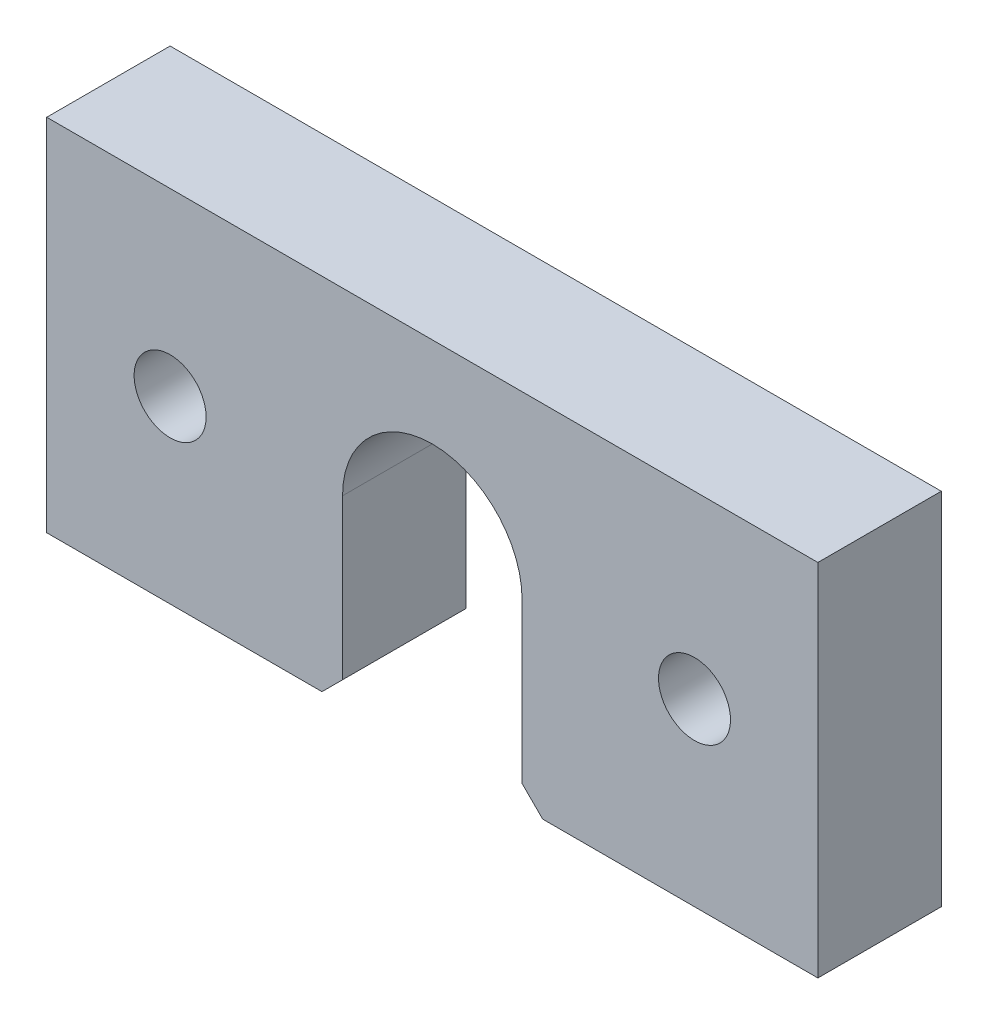
ISO-10303-21;
HEADER;
FILE_DESCRIPTION(('STEP AP214'),'2;1');
FILE_NAME('part.step','',(''),(''),'','','');
FILE_SCHEMA(('AUTOMOTIVE_DESIGN { 1 0 10303 214 1 1 1 1 }'));
ENDSEC;
DATA;
#1=APPLICATION_CONTEXT('core data for automotive mechanical design processes');
#2=APPLICATION_PROTOCOL_DEFINITION('international standard','automotive_design',2000,#1);
#3=PRODUCT_CONTEXT('',#1,'mechanical');
#4=PRODUCT('Part','Part','',(#3));
#5=PRODUCT_RELATED_PRODUCT_CATEGORY('part','',(#4));
#6=PRODUCT_DEFINITION_FORMATION('','',#4);
#7=PRODUCT_DEFINITION_CONTEXT('part definition',#1,'design');
#8=PRODUCT_DEFINITION('design','',#6,#7);
#9=PRODUCT_DEFINITION_SHAPE('','',#8);
#10=(LENGTH_UNIT() NAMED_UNIT(*) SI_UNIT(.MILLI.,.METRE.));
#11=(NAMED_UNIT(*) PLANE_ANGLE_UNIT() SI_UNIT($,.RADIAN.));
#12=(NAMED_UNIT(*) SI_UNIT($,.STERADIAN.) SOLID_ANGLE_UNIT());
#13=UNCERTAINTY_MEASURE_WITH_UNIT(LENGTH_MEASURE(1.E-05),#10,'distance_accuracy_value','');
#14=(GEOMETRIC_REPRESENTATION_CONTEXT(3) GLOBAL_UNCERTAINTY_ASSIGNED_CONTEXT((#13)) GLOBAL_UNIT_ASSIGNED_CONTEXT((#10,
#11,#12)) REPRESENTATION_CONTEXT('',''));
#15=CARTESIAN_POINT('',(0.,0.,0.));
#16=DIRECTION('',(0.,0.,1.));
#17=DIRECTION('',(1.,0.,0.));
#18=AXIS2_PLACEMENT_3D('',#15,#16,#17);
#19=CARTESIAN_POINT('',(37.5,-17.5,12.));
#20=DIRECTION('',(0.,1.,0.));
#21=DIRECTION('',(-1.,0.,0.));
#22=AXIS2_PLACEMENT_3D('',#19,#20,#21);
#23=PLANE('',#22);
#24=DIRECTION('',(1.,0.,0.));
#25=VECTOR('',#24,1.);
#26=CARTESIAN_POINT('',(37.5,-17.5,0.));
#27=LINE('',#26,#25);
#28=CARTESIAN_POINT('',(-37.5,-17.5,0.));
#29=VERTEX_POINT('',#28);
#30=CARTESIAN_POINT('',(-10.73125,-17.5,0.));
#31=VERTEX_POINT('',#30);
#32=EDGE_CURVE('E179',#29,#31,#27,.T.);
#33=ORIENTED_EDGE('',*,*,#32,.T.);
#34=DIRECTION('',(0.,0.,1.));
#35=VECTOR('',#34,1.);
#36=CARTESIAN_POINT('',(-10.73125,-17.5,12.));
#37=LINE('',#36,#35);
#38=CARTESIAN_POINT('',(-10.73125,-17.5,12.));
#39=VERTEX_POINT('',#38);
#40=EDGE_CURVE('E11',#31,#39,#37,.T.);
#41=ORIENTED_EDGE('',*,*,#40,.T.);
#42=DIRECTION('',(1.,0.,0.));
#43=VECTOR('',#42,1.);
#44=CARTESIAN_POINT('',(37.5,-17.5,12.));
#45=LINE('',#44,#43);
#46=CARTESIAN_POINT('',(-37.5,-17.5,12.));
#47=VERTEX_POINT('',#46);
#48=EDGE_CURVE('E169',#47,#39,#45,.T.);
#49=ORIENTED_EDGE('',*,*,#48,.F.);
#50=DIRECTION('',(0.,0.,-1.));
#51=VECTOR('',#50,1.);
#52=CARTESIAN_POINT('',(-37.5,-17.5,12.));
#53=LINE('',#52,#51);
#54=EDGE_CURVE('E192',#47,#29,#53,.T.);
#55=ORIENTED_EDGE('',*,*,#54,.T.);
#56=EDGE_LOOP('',(#33,#41,#49,#55));
#57=FACE_BOUND('',#56,.T.);
#58=ADVANCED_FACE('F49',(#57),#23,.F.);
#59=CARTESIAN_POINT('',(-37.5,-17.5,12.));
#60=DIRECTION('',(1.,0.,0.));
#61=DIRECTION('',(0.,0.,-1.));
#62=AXIS2_PLACEMENT_3D('',#59,#60,#61);
#63=PLANE('',#62);
#64=DIRECTION('',(0.,-1.,0.));
#65=VECTOR('',#64,1.);
#66=CARTESIAN_POINT('',(-37.5,-17.5,0.));
#67=LINE('',#66,#65);
#68=CARTESIAN_POINT('',(-37.5,17.5,0.));
#69=VERTEX_POINT('',#68);
#70=EDGE_CURVE('E136',#69,#29,#67,.T.);
#71=ORIENTED_EDGE('',*,*,#70,.T.);
#72=ORIENTED_EDGE('',*,*,#54,.F.);
#73=DIRECTION('',(0.,-1.,0.));
#74=VECTOR('',#73,1.);
#75=CARTESIAN_POINT('',(-37.5,-17.5,12.));
#76=LINE('',#75,#74);
#77=CARTESIAN_POINT('',(-37.5,17.5,12.));
#78=VERTEX_POINT('',#77);
#79=EDGE_CURVE('E164',#78,#47,#76,.T.);
#80=ORIENTED_EDGE('',*,*,#79,.F.);
#81=DIRECTION('',(0.,0.,-1.));
#82=VECTOR('',#81,1.);
#83=CARTESIAN_POINT('',(-37.5,17.5,12.));
#84=LINE('',#83,#82);
#85=EDGE_CURVE('E175',#78,#69,#84,.T.);
#86=ORIENTED_EDGE('',*,*,#85,.T.);
#87=EDGE_LOOP('',(#71,#72,#80,#86));
#88=FACE_BOUND('',#87,.T.);
#89=ADVANCED_FACE('F235',(#88),#63,.F.);
#90=CARTESIAN_POINT('',(10.73125,-17.5,12.));
#91=VERTEX_POINT('',#90);
#92=CARTESIAN_POINT('',(37.5,-17.5,12.));
#93=VERTEX_POINT('',#92);
#94=EDGE_CURVE('E167',#91,#93,#45,.T.);
#95=ORIENTED_EDGE('',*,*,#94,.F.);
#96=DIRECTION('',(0.,0.,-1.));
#97=VECTOR('',#96,1.);
#98=CARTESIAN_POINT('',(10.73125,-17.5,12.));
#99=LINE('',#98,#97);
#100=CARTESIAN_POINT('',(10.73125,-17.5,0.));
#101=VERTEX_POINT('',#100);
#102=EDGE_CURVE('E195',#91,#101,#99,.T.);
#103=ORIENTED_EDGE('',*,*,#102,.T.);
#104=CARTESIAN_POINT('',(37.5,-17.5,0.));
#105=VERTEX_POINT('',#104);
#106=EDGE_CURVE('E178',#101,#105,#27,.T.);
#107=ORIENTED_EDGE('',*,*,#106,.T.);
#108=DIRECTION('',(0.,0.,-1.));
#109=VECTOR('',#108,1.);
#110=CARTESIAN_POINT('',(37.5,-17.5,12.));
#111=LINE('',#110,#109);
#112=EDGE_CURVE('E189',#93,#105,#111,.T.);
#113=ORIENTED_EDGE('',*,*,#112,.F.);
#114=EDGE_LOOP('',(#95,#103,#107,#113));
#115=FACE_BOUND('',#114,.T.);
#116=ADVANCED_FACE('F220',(#115),#23,.F.);
#117=CARTESIAN_POINT('',(37.5,-17.5,12.));
#118=DIRECTION('',(-1.,0.,0.));
#119=DIRECTION('',(0.,0.,1.));
#120=AXIS2_PLACEMENT_3D('',#117,#118,#119);
#121=PLANE('',#120);
#122=DIRECTION('',(0.,1.,0.));
#123=VECTOR('',#122,1.);
#124=CARTESIAN_POINT('',(37.5,-17.5,0.));
#125=LINE('',#124,#123);
#126=CARTESIAN_POINT('',(37.5,17.5,0.));
#127=VERTEX_POINT('',#126);
#128=EDGE_CURVE('E181',#105,#127,#125,.T.);
#129=ORIENTED_EDGE('',*,*,#128,.T.);
#130=DIRECTION('',(0.,0.,-1.));
#131=VECTOR('',#130,1.);
#132=CARTESIAN_POINT('',(37.5,17.5,12.));
#133=LINE('',#132,#131);
#134=CARTESIAN_POINT('',(37.5,17.5,12.));
#135=VERTEX_POINT('',#134);
#136=EDGE_CURVE('E186',#135,#127,#133,.T.);
#137=ORIENTED_EDGE('',*,*,#136,.F.);
#138=DIRECTION('',(0.,1.,0.));
#139=VECTOR('',#138,1.);
#140=CARTESIAN_POINT('',(37.5,-17.5,12.));
#141=LINE('',#140,#139);
#142=EDGE_CURVE('E171',#93,#135,#141,.T.);
#143=ORIENTED_EDGE('',*,*,#142,.F.);
#144=ORIENTED_EDGE('',*,*,#112,.T.);
#145=EDGE_LOOP('',(#129,#137,#143,#144));
#146=FACE_BOUND('',#145,.T.);
#147=ADVANCED_FACE('F225',(#146),#121,.F.);
#148=CARTESIAN_POINT('',(37.5,17.5,12.));
#149=DIRECTION('',(0.,-1.,0.));
#150=DIRECTION('',(1.,0.,0.));
#151=AXIS2_PLACEMENT_3D('',#148,#149,#150);
#152=PLANE('',#151);
#153=DIRECTION('',(-1.,0.,0.));
#154=VECTOR('',#153,1.);
#155=CARTESIAN_POINT('',(37.5,17.5,0.));
#156=LINE('',#155,#154);
#157=EDGE_CURVE('E168',#127,#69,#156,.T.);
#158=ORIENTED_EDGE('',*,*,#157,.T.);
#159=ORIENTED_EDGE('',*,*,#85,.F.);
#160=DIRECTION('',(-1.,0.,0.));
#161=VECTOR('',#160,1.);
#162=CARTESIAN_POINT('',(37.5,17.5,12.));
#163=LINE('',#162,#161);
#164=EDGE_CURVE('E173',#135,#78,#163,.T.);
#165=ORIENTED_EDGE('',*,*,#164,.F.);
#166=ORIENTED_EDGE('',*,*,#136,.T.);
#167=EDGE_LOOP('',(#158,#159,#165,#166));
#168=FACE_BOUND('',#167,.T.);
#169=ADVANCED_FACE('F231',(#168),#152,.F.);
#170=CARTESIAN_POINT('',(0.,0.,12.));
#171=DIRECTION('',(0.,0.,1.));
#172=DIRECTION('',(1.,0.,0.));
#173=AXIS2_PLACEMENT_3D('',#170,#171,#172);
#174=PLANE('',#173);
#175=CARTESIAN_POINT('',(-25.5,0.,12.));
#176=DIRECTION('',(0.,0.,1.));
#177=DIRECTION('',(1.,0.,0.));
#178=AXIS2_PLACEMENT_3D('',#175,#176,#177);
#179=CIRCLE('',#178,3.5);
#180=CARTESIAN_POINT('',(-22.,0.,12.));
#181=VERTEX_POINT('',#180);
#182=EDGE_CURVE('E284',#181,#181,#179,.T.);
#183=ORIENTED_EDGE('',*,*,#182,.F.);
#184=EDGE_LOOP('',(#183));
#185=FACE_BOUND('',#184,.T.);
#186=CARTESIAN_POINT('',(25.5,0.,12.));
#187=DIRECTION('',(0.,0.,1.));
#188=DIRECTION('',(1.,0.,0.));
#189=AXIS2_PLACEMENT_3D('',#186,#187,#188);
#190=CIRCLE('',#189,3.5);
#191=CARTESIAN_POINT('',(29.,0.,12.));
#192=VERTEX_POINT('',#191);
#193=EDGE_CURVE('E155',#192,#192,#190,.T.);
#194=ORIENTED_EDGE('',*,*,#193,.F.);
#195=EDGE_LOOP('',(#194));
#196=FACE_BOUND('',#195,.T.);
#197=DIRECTION('',(0.,-1.,0.));
#198=VECTOR('',#197,1.);
#199=CARTESIAN_POINT('',(8.73125,0.,12.));
#200=LINE('',#199,#198);
#201=CARTESIAN_POINT('',(8.73125,0.,12.));
#202=VERTEX_POINT('',#201);
#203=CARTESIAN_POINT('',(8.73125,-15.5,12.));
#204=VERTEX_POINT('',#203);
#205=EDGE_CURVE('E126',#202,#204,#200,.T.);
#206=ORIENTED_EDGE('',*,*,#205,.T.);
#207=DIRECTION('',(-0.707106781186546,0.707106781186549,0.));
#208=VECTOR('',#207,1.);
#209=CARTESIAN_POINT('',(-3.38437499999999,-3.38437499999998,12.));
#210=LINE('',#209,#208);
#211=EDGE_CURVE('E204',#204,#91,#210,.F.);
#212=ORIENTED_EDGE('',*,*,#211,.T.);
#213=ORIENTED_EDGE('',*,*,#94,.T.);
#214=ORIENTED_EDGE('',*,*,#142,.T.);
#215=ORIENTED_EDGE('',*,*,#164,.T.);
#216=ORIENTED_EDGE('',*,*,#79,.T.);
#217=ORIENTED_EDGE('',*,*,#48,.T.);
#218=DIRECTION('',(-0.70710678118655,-0.707106781186545,0.));
#219=VECTOR('',#218,1.);
#220=CARTESIAN_POINT('',(3.38437500000004,-3.38437500000006,12.));
#221=LINE('',#220,#219);
#222=CARTESIAN_POINT('',(-8.73125,-15.5,12.));
#223=VERTEX_POINT('',#222);
#224=EDGE_CURVE('E70',#39,#223,#221,.F.);
#225=ORIENTED_EDGE('',*,*,#224,.T.);
#226=DIRECTION('',(0.,1.,0.));
#227=VECTOR('',#226,1.);
#228=CARTESIAN_POINT('',(-8.73125,0.,12.));
#229=LINE('',#228,#227);
#230=CARTESIAN_POINT('',(-8.73125,0.,12.));
#231=VERTEX_POINT('',#230);
#232=EDGE_CURVE('E150',#223,#231,#229,.T.);
#233=ORIENTED_EDGE('',*,*,#232,.T.);
#234=CARTESIAN_POINT('',(0.,0.,12.));
#235=DIRECTION('',(0.,0.,1.));
#236=DIRECTION('',(1.,0.,0.));
#237=AXIS2_PLACEMENT_3D('',#234,#235,#236);
#238=CIRCLE('',#237,8.73125);
#239=EDGE_CURVE('E143',#231,#202,#238,.F.);
#240=ORIENTED_EDGE('',*,*,#239,.T.);
#241=EDGE_LOOP('',(#206,#212,#213,#214,#215,#216,#217,#225,#233,#240));
#242=FACE_BOUND('',#241,.T.);
#243=ADVANCED_FACE('F149',(#185,#196,#242),#174,.T.);
#244=CARTESIAN_POINT('',(0.,0.,0.));
#245=DIRECTION('',(0.,0.,1.));
#246=DIRECTION('',(1.,0.,0.));
#247=AXIS2_PLACEMENT_3D('',#244,#245,#246);
#248=PLANE('',#247);
#249=CARTESIAN_POINT('',(-25.5,0.,0.));
#250=DIRECTION('',(0.,0.,1.));
#251=DIRECTION('',(1.,0.,0.));
#252=AXIS2_PLACEMENT_3D('',#249,#250,#251);
#253=CIRCLE('',#252,3.5);
#254=CARTESIAN_POINT('',(-22.,0.,0.));
#255=VERTEX_POINT('',#254);
#256=EDGE_CURVE('E281',#255,#255,#253,.T.);
#257=ORIENTED_EDGE('',*,*,#256,.T.);
#258=EDGE_LOOP('',(#257));
#259=FACE_BOUND('',#258,.T.);
#260=CARTESIAN_POINT('',(25.5,0.,0.));
#261=DIRECTION('',(0.,0.,1.));
#262=DIRECTION('',(1.,0.,0.));
#263=AXIS2_PLACEMENT_3D('',#260,#261,#262);
#264=CIRCLE('',#263,3.5);
#265=CARTESIAN_POINT('',(29.,0.,0.));
#266=VERTEX_POINT('',#265);
#267=EDGE_CURVE('E151',#266,#266,#264,.T.);
#268=ORIENTED_EDGE('',*,*,#267,.T.);
#269=EDGE_LOOP('',(#268));
#270=FACE_BOUND('',#269,.T.);
#271=ORIENTED_EDGE('',*,*,#106,.F.);
#272=DIRECTION('',(0.707106781186546,-0.707106781186549,0.));
#273=VECTOR('',#272,1.);
#274=CARTESIAN_POINT('',(10.73125,-17.5,0.));
#275=LINE('',#274,#273);
#276=CARTESIAN_POINT('',(8.73125,-15.5,0.));
#277=VERTEX_POINT('',#276);
#278=EDGE_CURVE('E200',#101,#277,#275,.F.);
#279=ORIENTED_EDGE('',*,*,#278,.T.);
#280=DIRECTION('',(0.,-1.,0.));
#281=VECTOR('',#280,1.);
#282=CARTESIAN_POINT('',(8.73125,0.,0.));
#283=LINE('',#282,#281);
#284=CARTESIAN_POINT('',(8.73125,0.,0.));
#285=VERTEX_POINT('',#284);
#286=EDGE_CURVE('E160',#285,#277,#283,.T.);
#287=ORIENTED_EDGE('',*,*,#286,.F.);
#288=CARTESIAN_POINT('',(0.,0.,0.));
#289=DIRECTION('',(0.,0.,-1.));
#290=DIRECTION('',(-1.,0.,0.));
#291=AXIS2_PLACEMENT_3D('',#288,#289,#290);
#292=CIRCLE('',#291,8.73125);
#293=CARTESIAN_POINT('',(-8.73125,0.,0.));
#294=VERTEX_POINT('',#293);
#295=EDGE_CURVE('E146',#294,#285,#292,.T.);
#296=ORIENTED_EDGE('',*,*,#295,.F.);
#297=DIRECTION('',(0.,1.,0.));
#298=VECTOR('',#297,1.);
#299=CARTESIAN_POINT('',(-8.73125,0.,0.));
#300=LINE('',#299,#298);
#301=CARTESIAN_POINT('',(-8.73125,-15.5,0.));
#302=VERTEX_POINT('',#301);
#303=EDGE_CURVE('E147',#302,#294,#300,.T.);
#304=ORIENTED_EDGE('',*,*,#303,.F.);
#305=DIRECTION('',(0.70710678118655,0.707106781186545,0.));
#306=VECTOR('',#305,1.);
#307=CARTESIAN_POINT('',(-8.73125,-15.5,0.));
#308=LINE('',#307,#306);
#309=EDGE_CURVE('E198',#302,#31,#308,.F.);
#310=ORIENTED_EDGE('',*,*,#309,.T.);
#311=ORIENTED_EDGE('',*,*,#32,.F.);
#312=ORIENTED_EDGE('',*,*,#70,.F.);
#313=ORIENTED_EDGE('',*,*,#157,.F.);
#314=ORIENTED_EDGE('',*,*,#128,.F.);
#315=EDGE_LOOP('',(#271,#279,#287,#296,#304,#310,#311,#312,#313,#314));
#316=FACE_BOUND('',#315,.T.);
#317=ADVANCED_FACE('F213',(#259,#270,#316),#248,.F.);
#318=CARTESIAN_POINT('',(0.,0.,12.001));
#319=DIRECTION('',(0.,0.,-1.));
#320=DIRECTION('',(-1.,0.,0.));
#321=AXIS2_PLACEMENT_3D('',#318,#319,#320);
#322=CYLINDRICAL_SURFACE('',#321,8.73125);
#323=DIRECTION('',(0.,0.,-1.));
#324=VECTOR('',#323,1.);
#325=CARTESIAN_POINT('',(-8.73125,0.,12.001));
#326=LINE('',#325,#324);
#327=EDGE_CURVE('E137',#231,#294,#326,.T.);
#328=ORIENTED_EDGE('',*,*,#327,.T.);
#329=ORIENTED_EDGE('',*,*,#295,.T.);
#330=DIRECTION('',(0.,0.,-1.));
#331=VECTOR('',#330,1.);
#332=CARTESIAN_POINT('',(8.73125,0.,12.001));
#333=LINE('',#332,#331);
#334=EDGE_CURVE('E130',#202,#285,#333,.T.);
#335=ORIENTED_EDGE('',*,*,#334,.F.);
#336=ORIENTED_EDGE('',*,*,#239,.F.);
#337=EDGE_LOOP('',(#328,#329,#335,#336));
#338=FACE_BOUND('',#337,.T.);
#339=ADVANCED_FACE('F142',(#338),#322,.F.);
#340=CARTESIAN_POINT('',(-8.73125,0.,12.001));
#341=DIRECTION('',(-1.,0.,0.));
#342=DIRECTION('',(0.,-1.,0.));
#343=AXIS2_PLACEMENT_3D('',#340,#341,#342);
#344=PLANE('',#343);
#345=ORIENTED_EDGE('',*,*,#232,.F.);
#346=DIRECTION('',(0.,0.,-1.));
#347=VECTOR('',#346,1.);
#348=CARTESIAN_POINT('',(-8.73125,-15.5,12.001));
#349=LINE('',#348,#347);
#350=EDGE_CURVE('E58',#223,#302,#349,.T.);
#351=ORIENTED_EDGE('',*,*,#350,.T.);
#352=ORIENTED_EDGE('',*,*,#303,.T.);
#353=ORIENTED_EDGE('',*,*,#327,.F.);
#354=EDGE_LOOP('',(#345,#351,#352,#353));
#355=FACE_BOUND('',#354,.T.);
#356=ADVANCED_FACE('F209',(#355),#344,.F.);
#357=CARTESIAN_POINT('',(8.73125,0.,12.001));
#358=DIRECTION('',(1.,0.,0.));
#359=DIRECTION('',(0.,1.,0.));
#360=AXIS2_PLACEMENT_3D('',#357,#358,#359);
#361=PLANE('',#360);
#362=ORIENTED_EDGE('',*,*,#286,.T.);
#363=DIRECTION('',(0.,0.,1.));
#364=VECTOR('',#363,1.);
#365=CARTESIAN_POINT('',(8.73125,-15.5,12.001));
#366=LINE('',#365,#364);
#367=EDGE_CURVE('E133',#277,#204,#366,.T.);
#368=ORIENTED_EDGE('',*,*,#367,.T.);
#369=ORIENTED_EDGE('',*,*,#205,.F.);
#370=ORIENTED_EDGE('',*,*,#334,.T.);
#371=EDGE_LOOP('',(#362,#368,#369,#370));
#372=FACE_BOUND('',#371,.T.);
#373=ADVANCED_FACE('F129',(#372),#361,.F.);
#374=CARTESIAN_POINT('',(25.5,0.,12.));
#375=DIRECTION('',(0.,0.,1.));
#376=DIRECTION('',(1.,0.,0.));
#377=AXIS2_PLACEMENT_3D('',#374,#375,#376);
#378=CYLINDRICAL_SURFACE('',#377,3.5);
#379=ORIENTED_EDGE('',*,*,#267,.F.);
#380=EDGE_LOOP('',(#379));
#381=FACE_BOUND('',#380,.T.);
#382=ORIENTED_EDGE('',*,*,#193,.T.);
#383=EDGE_LOOP('',(#382));
#384=FACE_BOUND('',#383,.T.);
#385=ADVANCED_FACE('F268',(#381,#384),#378,.F.);
#386=CARTESIAN_POINT('',(-25.5,0.,12.));
#387=DIRECTION('',(0.,0.,1.));
#388=DIRECTION('',(1.,0.,0.));
#389=AXIS2_PLACEMENT_3D('',#386,#387,#388);
#390=CYLINDRICAL_SURFACE('',#389,3.5);
#391=ORIENTED_EDGE('',*,*,#256,.F.);
#392=EDGE_LOOP('',(#391));
#393=FACE_BOUND('',#392,.T.);
#394=ORIENTED_EDGE('',*,*,#182,.T.);
#395=EDGE_LOOP('',(#394));
#396=FACE_BOUND('',#395,.T.);
#397=ADVANCED_FACE('F240',(#393,#396),#390,.F.);
#398=CARTESIAN_POINT('',(10.73125,-17.5,12.));
#399=DIRECTION('',(0.707106781186549,0.707106781186546,0.));
#400=DIRECTION('',(0.,0.,-1.));
#401=AXIS2_PLACEMENT_3D('',#398,#399,#400);
#402=PLANE('',#401);
#403=ORIENTED_EDGE('',*,*,#211,.F.);
#404=ORIENTED_EDGE('',*,*,#367,.F.);
#405=ORIENTED_EDGE('',*,*,#278,.F.);
#406=ORIENTED_EDGE('',*,*,#102,.F.);
#407=EDGE_LOOP('',(#403,#404,#405,#406));
#408=FACE_BOUND('',#407,.T.);
#409=ADVANCED_FACE('F215',(#408),#402,.F.);
#410=CARTESIAN_POINT('',(-8.73125,-15.5,12.001));
#411=DIRECTION('',(-0.707106781186545,0.70710678118655,0.));
#412=DIRECTION('',(0.,0.,-1.));
#413=AXIS2_PLACEMENT_3D('',#410,#411,#412);
#414=PLANE('',#413);
#415=ORIENTED_EDGE('',*,*,#224,.F.);
#416=ORIENTED_EDGE('',*,*,#40,.F.);
#417=ORIENTED_EDGE('',*,*,#309,.F.);
#418=ORIENTED_EDGE('',*,*,#350,.F.);
#419=EDGE_LOOP('',(#415,#416,#417,#418));
#420=FACE_BOUND('',#419,.T.);
#421=ADVANCED_FACE('F52',(#420),#414,.F.);
#422=CLOSED_SHELL('',(#58,#89,#116,#147,#169,#243,#317,#339,#356,#373,#385,#397,#409,#421));
#423=MANIFOLD_SOLID_BREP('B2',#422);
#424=ADVANCED_BREP_SHAPE_REPRESENTATION('',(#18,#423),#14);
#425=SHAPE_DEFINITION_REPRESENTATION(#9,#424);
ENDSEC;
END-ISO-10303-21;
